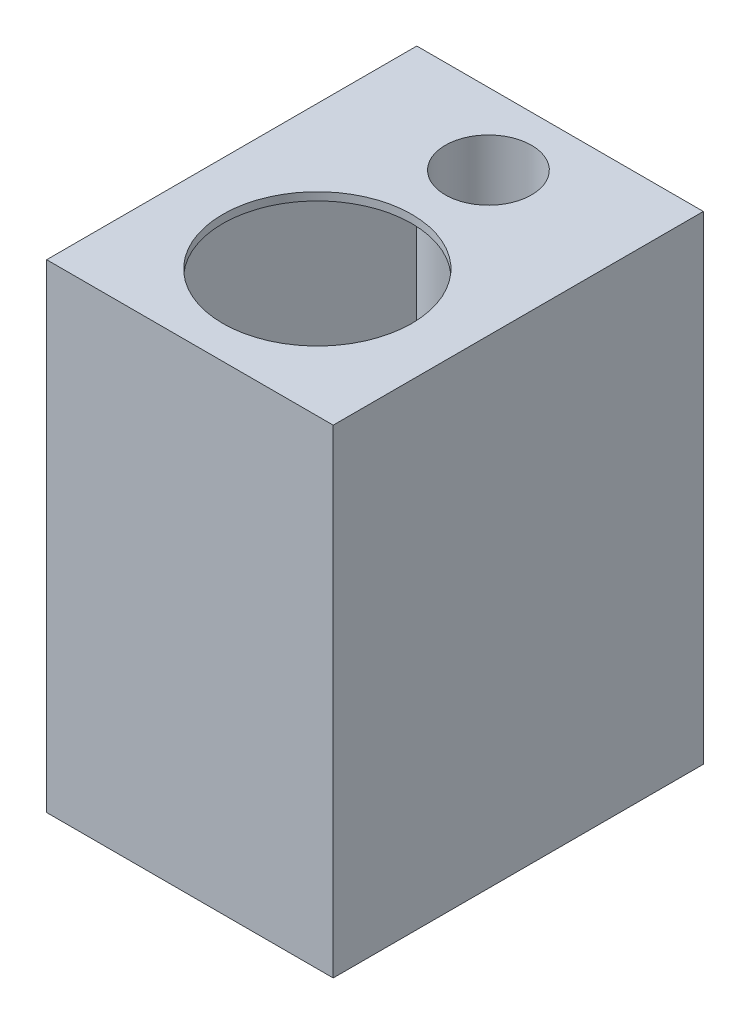
ISO-10303-21;
HEADER;
FILE_DESCRIPTION(('STEP AP214'),'2;1');
FILE_NAME('part.step','',(''),(''),'','','');
FILE_SCHEMA(('AUTOMOTIVE_DESIGN { 1 0 10303 214 1 1 1 1 }'));
ENDSEC;
DATA;
#1=APPLICATION_CONTEXT('core data for automotive mechanical design processes');
#2=APPLICATION_PROTOCOL_DEFINITION('international standard','automotive_design',2000,#1);
#3=PRODUCT_CONTEXT('',#1,'mechanical');
#4=PRODUCT('Part','Part','',(#3));
#5=PRODUCT_RELATED_PRODUCT_CATEGORY('part','',(#4));
#6=PRODUCT_DEFINITION_FORMATION('','',#4);
#7=PRODUCT_DEFINITION_CONTEXT('part definition',#1,'design');
#8=PRODUCT_DEFINITION('design','',#6,#7);
#9=PRODUCT_DEFINITION_SHAPE('','',#8);
#10=(LENGTH_UNIT() NAMED_UNIT(*) SI_UNIT(.MILLI.,.METRE.));
#11=(NAMED_UNIT(*) PLANE_ANGLE_UNIT() SI_UNIT($,.RADIAN.));
#12=(NAMED_UNIT(*) SI_UNIT($,.STERADIAN.) SOLID_ANGLE_UNIT());
#13=UNCERTAINTY_MEASURE_WITH_UNIT(LENGTH_MEASURE(1.E-05),#10,'distance_accuracy_value','');
#14=(GEOMETRIC_REPRESENTATION_CONTEXT(3) GLOBAL_UNCERTAINTY_ASSIGNED_CONTEXT((#13)) GLOBAL_UNIT_ASSIGNED_CONTEXT((#10,
#11,#12)) REPRESENTATION_CONTEXT('',''));
#15=CARTESIAN_POINT('',(0.,0.,0.));
#16=DIRECTION('',(0.,0.,1.));
#17=DIRECTION('',(1.,0.,0.));
#18=AXIS2_PLACEMENT_3D('',#15,#16,#17);
#19=CARTESIAN_POINT('',(0.,0.,0.));
#20=DIRECTION('',(0.,-1.,0.));
#21=DIRECTION('',(0.,0.,-1.));
#22=AXIS2_PLACEMENT_3D('',#19,#20,#21);
#23=PLANE('',#22);
#24=DIRECTION('',(-1.,0.,0.));
#25=VECTOR('',#24,1.);
#26=CARTESIAN_POINT('',(4.,0.,-4.));
#27=LINE('',#26,#25);
#28=CARTESIAN_POINT('',(140.,0.,-4.));
#29=VERTEX_POINT('',#28);
#30=CARTESIAN_POINT('',(4.,0.,-4.));
#31=VERTEX_POINT('',#30);
#32=EDGE_CURVE('E50',#29,#31,#27,.T.);
#33=ORIENTED_EDGE('',*,*,#32,.T.);
#34=DIRECTION('',(0.,0.,-1.));
#35=VECTOR('',#34,1.);
#36=CARTESIAN_POINT('',(4.,0.,-4.));
#37=LINE('',#36,#35);
#38=CARTESIAN_POINT('',(4.,0.,-182.));
#39=VERTEX_POINT('',#38);
#40=EDGE_CURVE('E54',#31,#39,#37,.T.);
#41=ORIENTED_EDGE('',*,*,#40,.T.);
#42=DIRECTION('',(1.,0.,0.));
#43=VECTOR('',#42,1.);
#44=CARTESIAN_POINT('',(4.,0.,-182.));
#45=LINE('',#44,#43);
#46=CARTESIAN_POINT('',(140.,0.,-182.));
#47=VERTEX_POINT('',#46);
#48=EDGE_CURVE('E129',#39,#47,#45,.T.);
#49=ORIENTED_EDGE('',*,*,#48,.T.);
#50=DIRECTION('',(0.,0.,1.));
#51=VECTOR('',#50,1.);
#52=CARTESIAN_POINT('',(140.,0.,-4.));
#53=LINE('',#52,#51);
#54=EDGE_CURVE('E108',#47,#29,#53,.T.);
#55=ORIENTED_EDGE('',*,*,#54,.T.);
#56=EDGE_LOOP('',(#33,#41,#49,#55));
#57=FACE_BOUND('',#56,.T.);
#58=CARTESIAN_POINT('',(72.,0.,-64.));
#59=DIRECTION('',(0.,1.,0.));
#60=DIRECTION('',(0.,0.,1.));
#61=AXIS2_PLACEMENT_3D('',#58,#59,#60);
#62=CIRCLE('',#61,47.5);
#63=CARTESIAN_POINT('',(72.,0.,-16.5));
#64=VERTEX_POINT('',#63);
#65=EDGE_CURVE('E127',#64,#64,#62,.T.);
#66=ORIENTED_EDGE('',*,*,#65,.T.);
#67=EDGE_LOOP('',(#66));
#68=FACE_BOUND('',#67,.T.);
#69=CARTESIAN_POINT('',(72.,0.,-150.));
#70=DIRECTION('',(0.,-1.,0.));
#71=DIRECTION('',(0.,0.,-1.));
#72=AXIS2_PLACEMENT_3D('',#69,#70,#71);
#73=CIRCLE('',#72,25.65);
#74=CARTESIAN_POINT('',(72.,0.,-124.35));
#75=VERTEX_POINT('',#74);
#76=EDGE_CURVE('E316',#75,#75,#73,.T.);
#77=ORIENTED_EDGE('',*,*,#76,.F.);
#78=EDGE_LOOP('',(#77));
#79=FACE_BOUND('',#78,.T.);
#80=ADVANCED_FACE('F35',(#57,#68,#79),#23,.T.);
#81=CARTESIAN_POINT('',(0.,4.,0.));
#82=DIRECTION('',(1.,0.,0.));
#83=DIRECTION('',(0.,0.,-1.));
#84=AXIS2_PLACEMENT_3D('',#81,#82,#83);
#85=PLANE('',#84);
#86=DIRECTION('',(0.,-1.,0.));
#87=VECTOR('',#86,1.);
#88=CARTESIAN_POINT('',(0.,4.,-186.));
#89=LINE('',#88,#87);
#90=CARTESIAN_POINT('',(0.,4.,-186.));
#91=VERTEX_POINT('',#90);
#92=CARTESIAN_POINT('',(0.,-236.6,-186.));
#93=VERTEX_POINT('',#92);
#94=EDGE_CURVE('E157',#91,#93,#89,.T.);
#95=ORIENTED_EDGE('',*,*,#94,.T.);
#96=DIRECTION('',(0.,0.,-1.));
#97=VECTOR('',#96,1.);
#98=CARTESIAN_POINT('',(0.,-236.6,0.));
#99=LINE('',#98,#97);
#100=CARTESIAN_POINT('',(0.,-236.6,0.));
#101=VERTEX_POINT('',#100);
#102=EDGE_CURVE('E113',#101,#93,#99,.T.);
#103=ORIENTED_EDGE('',*,*,#102,.F.);
#104=DIRECTION('',(0.,-1.,0.));
#105=VECTOR('',#104,1.);
#106=CARTESIAN_POINT('',(0.,4.,0.));
#107=LINE('',#106,#105);
#108=CARTESIAN_POINT('',(0.,4.,0.));
#109=VERTEX_POINT('',#108);
#110=EDGE_CURVE('E11',#109,#101,#107,.T.);
#111=ORIENTED_EDGE('',*,*,#110,.F.);
#112=DIRECTION('',(0.,0.,1.));
#113=VECTOR('',#112,1.);
#114=CARTESIAN_POINT('',(0.,4.,0.));
#115=LINE('',#114,#113);
#116=EDGE_CURVE('E148',#91,#109,#115,.T.);
#117=ORIENTED_EDGE('',*,*,#116,.F.);
#118=EDGE_LOOP('',(#95,#103,#111,#117));
#119=FACE_BOUND('',#118,.T.);
#120=ADVANCED_FACE('F37',(#119),#85,.F.);
#121=CARTESIAN_POINT('',(0.,4.,0.));
#122=DIRECTION('',(0.,0.,-1.));
#123=DIRECTION('',(-1.,0.,0.));
#124=AXIS2_PLACEMENT_3D('',#121,#122,#123);
#125=PLANE('',#124);
#126=ORIENTED_EDGE('',*,*,#110,.T.);
#127=DIRECTION('',(-1.,0.,0.));
#128=VECTOR('',#127,1.);
#129=CARTESIAN_POINT('',(0.,-236.6,0.));
#130=LINE('',#129,#128);
#131=CARTESIAN_POINT('',(144.,-236.6,0.));
#132=VERTEX_POINT('',#131);
#133=EDGE_CURVE('E145',#132,#101,#130,.T.);
#134=ORIENTED_EDGE('',*,*,#133,.F.);
#135=DIRECTION('',(0.,-1.,0.));
#136=VECTOR('',#135,1.);
#137=CARTESIAN_POINT('',(144.,4.,0.));
#138=LINE('',#137,#136);
#139=CARTESIAN_POINT('',(144.,4.,0.));
#140=VERTEX_POINT('',#139);
#141=EDGE_CURVE('E43',#140,#132,#138,.T.);
#142=ORIENTED_EDGE('',*,*,#141,.F.);
#143=DIRECTION('',(1.,0.,0.));
#144=VECTOR('',#143,1.);
#145=CARTESIAN_POINT('',(0.,4.,0.));
#146=LINE('',#145,#144);
#147=EDGE_CURVE('E151',#109,#140,#146,.T.);
#148=ORIENTED_EDGE('',*,*,#147,.F.);
#149=EDGE_LOOP('',(#126,#134,#142,#148));
#150=FACE_BOUND('',#149,.T.);
#151=ADVANCED_FACE('F171',(#150),#125,.F.);
#152=CARTESIAN_POINT('',(144.,4.,0.));
#153=DIRECTION('',(-1.,0.,0.));
#154=DIRECTION('',(0.,0.,1.));
#155=AXIS2_PLACEMENT_3D('',#152,#153,#154);
#156=PLANE('',#155);
#157=ORIENTED_EDGE('',*,*,#141,.T.);
#158=DIRECTION('',(0.,0.,1.));
#159=VECTOR('',#158,1.);
#160=CARTESIAN_POINT('',(144.,-236.6,0.));
#161=LINE('',#160,#159);
#162=CARTESIAN_POINT('',(144.,-236.6,-186.));
#163=VERTEX_POINT('',#162);
#164=EDGE_CURVE('E142',#163,#132,#161,.T.);
#165=ORIENTED_EDGE('',*,*,#164,.F.);
#166=DIRECTION('',(0.,-1.,0.));
#167=VECTOR('',#166,1.);
#168=CARTESIAN_POINT('',(144.,4.,-186.));
#169=LINE('',#168,#167);
#170=CARTESIAN_POINT('',(144.,4.,-186.));
#171=VERTEX_POINT('',#170);
#172=EDGE_CURVE('E159',#171,#163,#169,.T.);
#173=ORIENTED_EDGE('',*,*,#172,.F.);
#174=DIRECTION('',(0.,0.,-1.));
#175=VECTOR('',#174,1.);
#176=CARTESIAN_POINT('',(144.,4.,0.));
#177=LINE('',#176,#175);
#178=EDGE_CURVE('E153',#140,#171,#177,.T.);
#179=ORIENTED_EDGE('',*,*,#178,.F.);
#180=EDGE_LOOP('',(#157,#165,#173,#179));
#181=FACE_BOUND('',#180,.T.);
#182=ADVANCED_FACE('F164',(#181),#156,.F.);
#183=CARTESIAN_POINT('',(0.,4.,-186.));
#184=DIRECTION('',(0.,0.,1.));
#185=DIRECTION('',(1.,0.,0.));
#186=AXIS2_PLACEMENT_3D('',#183,#184,#185);
#187=PLANE('',#186);
#188=ORIENTED_EDGE('',*,*,#172,.T.);
#189=DIRECTION('',(1.,0.,0.));
#190=VECTOR('',#189,1.);
#191=CARTESIAN_POINT('',(0.,-236.6,-186.));
#192=LINE('',#191,#190);
#193=EDGE_CURVE('E139',#93,#163,#192,.T.);
#194=ORIENTED_EDGE('',*,*,#193,.F.);
#195=ORIENTED_EDGE('',*,*,#94,.F.);
#196=DIRECTION('',(-1.,0.,0.));
#197=VECTOR('',#196,1.);
#198=CARTESIAN_POINT('',(0.,4.,-186.));
#199=LINE('',#198,#197);
#200=EDGE_CURVE('E155',#171,#91,#199,.T.);
#201=ORIENTED_EDGE('',*,*,#200,.F.);
#202=EDGE_LOOP('',(#188,#194,#195,#201));
#203=FACE_BOUND('',#202,.T.);
#204=ADVANCED_FACE('F178',(#203),#187,.F.);
#205=CARTESIAN_POINT('',(0.,4.,0.));
#206=DIRECTION('',(0.,-1.,0.));
#207=DIRECTION('',(0.,0.,-1.));
#208=AXIS2_PLACEMENT_3D('',#205,#206,#207);
#209=PLANE('',#208);
#210=CARTESIAN_POINT('',(72.,4.,-150.));
#211=DIRECTION('',(0.,-1.,0.));
#212=DIRECTION('',(0.,0.,-1.));
#213=AXIS2_PLACEMENT_3D('',#210,#211,#212);
#214=CIRCLE('',#213,21.65);
#215=CARTESIAN_POINT('',(72.,4.,-171.65));
#216=VERTEX_POINT('',#215);
#217=EDGE_CURVE('E320',#216,#216,#214,.T.);
#218=ORIENTED_EDGE('',*,*,#217,.T.);
#219=EDGE_LOOP('',(#218));
#220=FACE_BOUND('',#219,.T.);
#221=CARTESIAN_POINT('',(72.,4.,-64.));
#222=DIRECTION('',(0.,1.,0.));
#223=DIRECTION('',(0.,0.,1.));
#224=AXIS2_PLACEMENT_3D('',#221,#222,#223);
#225=CIRCLE('',#224,47.5);
#226=CARTESIAN_POINT('',(72.,4.,-16.5));
#227=VERTEX_POINT('',#226);
#228=EDGE_CURVE('E326',#227,#227,#225,.T.);
#229=ORIENTED_EDGE('',*,*,#228,.F.);
#230=EDGE_LOOP('',(#229));
#231=FACE_BOUND('',#230,.T.);
#232=ORIENTED_EDGE('',*,*,#116,.T.);
#233=ORIENTED_EDGE('',*,*,#147,.T.);
#234=ORIENTED_EDGE('',*,*,#178,.T.);
#235=ORIENTED_EDGE('',*,*,#200,.T.);
#236=EDGE_LOOP('',(#232,#233,#234,#235));
#237=FACE_BOUND('',#236,.T.);
#238=ADVANCED_FACE('F180',(#220,#231,#237),#209,.F.);
#239=CARTESIAN_POINT('',(0.,-236.6,0.));
#240=DIRECTION('',(0.,-1.,0.));
#241=DIRECTION('',(0.,0.,-1.));
#242=AXIS2_PLACEMENT_3D('',#239,#240,#241);
#243=PLANE('',#242);
#244=ORIENTED_EDGE('',*,*,#102,.T.);
#245=ORIENTED_EDGE('',*,*,#193,.T.);
#246=ORIENTED_EDGE('',*,*,#164,.T.);
#247=ORIENTED_EDGE('',*,*,#133,.T.);
#248=EDGE_LOOP('',(#244,#245,#246,#247));
#249=FACE_BOUND('',#248,.T.);
#250=DIRECTION('',(0.,0.,-1.));
#251=VECTOR('',#250,1.);
#252=CARTESIAN_POINT('',(4.,-236.6,-4.));
#253=LINE('',#252,#251);
#254=CARTESIAN_POINT('',(4.,-236.6,-4.));
#255=VERTEX_POINT('',#254);
#256=CARTESIAN_POINT('',(4.,-236.6,-182.));
#257=VERTEX_POINT('',#256);
#258=EDGE_CURVE('E107',#255,#257,#253,.T.);
#259=ORIENTED_EDGE('',*,*,#258,.F.);
#260=DIRECTION('',(-1.,0.,0.));
#261=VECTOR('',#260,1.);
#262=CARTESIAN_POINT('',(4.,-236.6,-4.));
#263=LINE('',#262,#261);
#264=CARTESIAN_POINT('',(140.,-236.6,-4.));
#265=VERTEX_POINT('',#264);
#266=EDGE_CURVE('E98',#265,#255,#263,.T.);
#267=ORIENTED_EDGE('',*,*,#266,.F.);
#268=DIRECTION('',(0.,0.,1.));
#269=VECTOR('',#268,1.);
#270=CARTESIAN_POINT('',(140.,-236.6,-4.));
#271=LINE('',#270,#269);
#272=CARTESIAN_POINT('',(140.,-236.6,-182.));
#273=VERTEX_POINT('',#272);
#274=EDGE_CURVE('E121',#273,#265,#271,.T.);
#275=ORIENTED_EDGE('',*,*,#274,.F.);
#276=DIRECTION('',(1.,0.,0.));
#277=VECTOR('',#276,1.);
#278=CARTESIAN_POINT('',(4.,-236.6,-182.));
#279=LINE('',#278,#277);
#280=EDGE_CURVE('E119',#257,#273,#279,.T.);
#281=ORIENTED_EDGE('',*,*,#280,.F.);
#282=EDGE_LOOP('',(#259,#267,#275,#281));
#283=FACE_BOUND('',#282,.T.);
#284=ADVANCED_FACE('F117',(#249,#283),#243,.T.);
#285=CARTESIAN_POINT('',(4.,-236.6,-4.));
#286=DIRECTION('',(0.,0.,-1.));
#287=DIRECTION('',(-1.,0.,0.));
#288=AXIS2_PLACEMENT_3D('',#285,#286,#287);
#289=PLANE('',#288);
#290=ORIENTED_EDGE('',*,*,#32,.F.);
#291=DIRECTION('',(0.,1.,0.));
#292=VECTOR('',#291,1.);
#293=CARTESIAN_POINT('',(140.,-236.6,-4.));
#294=LINE('',#293,#292);
#295=EDGE_CURVE('E103',#265,#29,#294,.T.);
#296=ORIENTED_EDGE('',*,*,#295,.F.);
#297=ORIENTED_EDGE('',*,*,#266,.T.);
#298=DIRECTION('',(0.,1.,0.));
#299=VECTOR('',#298,1.);
#300=CARTESIAN_POINT('',(4.,-236.6,-4.));
#301=LINE('',#300,#299);
#302=EDGE_CURVE('E101',#255,#31,#301,.T.);
#303=ORIENTED_EDGE('',*,*,#302,.T.);
#304=EDGE_LOOP('',(#290,#296,#297,#303));
#305=FACE_BOUND('',#304,.T.);
#306=ADVANCED_FACE('F100',(#305),#289,.T.);
#307=CARTESIAN_POINT('',(4.,-236.6,-4.));
#308=DIRECTION('',(1.,0.,0.));
#309=DIRECTION('',(0.,0.,-1.));
#310=AXIS2_PLACEMENT_3D('',#307,#308,#309);
#311=PLANE('',#310);
#312=ORIENTED_EDGE('',*,*,#40,.F.);
#313=ORIENTED_EDGE('',*,*,#302,.F.);
#314=ORIENTED_EDGE('',*,*,#258,.T.);
#315=DIRECTION('',(0.,1.,0.));
#316=VECTOR('',#315,1.);
#317=CARTESIAN_POINT('',(4.,-236.6,-182.));
#318=LINE('',#317,#316);
#319=EDGE_CURVE('E114',#257,#39,#318,.T.);
#320=ORIENTED_EDGE('',*,*,#319,.T.);
#321=EDGE_LOOP('',(#312,#313,#314,#320));
#322=FACE_BOUND('',#321,.T.);
#323=ADVANCED_FACE('F111',(#322),#311,.T.);
#324=CARTESIAN_POINT('',(4.,-236.6,-182.));
#325=DIRECTION('',(0.,0.,1.));
#326=DIRECTION('',(1.,0.,0.));
#327=AXIS2_PLACEMENT_3D('',#324,#325,#326);
#328=PLANE('',#327);
#329=ORIENTED_EDGE('',*,*,#48,.F.);
#330=ORIENTED_EDGE('',*,*,#319,.F.);
#331=ORIENTED_EDGE('',*,*,#280,.T.);
#332=DIRECTION('',(0.,1.,0.));
#333=VECTOR('',#332,1.);
#334=CARTESIAN_POINT('',(140.,-236.6,-182.));
#335=LINE('',#334,#333);
#336=EDGE_CURVE('E133',#273,#47,#335,.T.);
#337=ORIENTED_EDGE('',*,*,#336,.T.);
#338=EDGE_LOOP('',(#329,#330,#331,#337));
#339=FACE_BOUND('',#338,.T.);
#340=ADVANCED_FACE('F237',(#339),#328,.T.);
#341=CARTESIAN_POINT('',(140.,-236.6,-4.));
#342=DIRECTION('',(-1.,0.,0.));
#343=DIRECTION('',(0.,0.,1.));
#344=AXIS2_PLACEMENT_3D('',#341,#342,#343);
#345=PLANE('',#344);
#346=ORIENTED_EDGE('',*,*,#54,.F.);
#347=ORIENTED_EDGE('',*,*,#336,.F.);
#348=ORIENTED_EDGE('',*,*,#274,.T.);
#349=ORIENTED_EDGE('',*,*,#295,.T.);
#350=EDGE_LOOP('',(#346,#347,#348,#349));
#351=FACE_BOUND('',#350,.T.);
#352=ADVANCED_FACE('F246',(#351),#345,.T.);
#353=CARTESIAN_POINT('',(72.,0.,-64.));
#354=DIRECTION('',(0.,1.,0.));
#355=DIRECTION('',(0.,0.,1.));
#356=AXIS2_PLACEMENT_3D('',#353,#354,#355);
#357=CYLINDRICAL_SURFACE('',#356,47.5);
#358=ORIENTED_EDGE('',*,*,#65,.F.);
#359=EDGE_LOOP('',(#358));
#360=FACE_BOUND('',#359,.T.);
#361=ORIENTED_EDGE('',*,*,#228,.T.);
#362=EDGE_LOOP('',(#361));
#363=FACE_BOUND('',#362,.T.);
#364=ADVANCED_FACE('F256',(#360,#363),#357,.F.);
#365=CARTESIAN_POINT('',(72.,4.,-150.));
#366=DIRECTION('',(0.,-1.,0.));
#367=DIRECTION('',(0.,0.,-1.));
#368=AXIS2_PLACEMENT_3D('',#365,#366,#367);
#369=CYLINDRICAL_SURFACE('',#368,21.65);
#370=ORIENTED_EDGE('',*,*,#217,.F.);
#371=EDGE_LOOP('',(#370));
#372=FACE_BOUND('',#371,.T.);
#373=CARTESIAN_POINT('',(72.,-103.7,-150.));
#374=DIRECTION('',(0.,-1.,0.));
#375=DIRECTION('',(0.,0.,-1.));
#376=AXIS2_PLACEMENT_3D('',#373,#374,#375);
#377=CIRCLE('',#376,21.65);
#378=CARTESIAN_POINT('',(72.,-103.7,-171.65));
#379=VERTEX_POINT('',#378);
#380=EDGE_CURVE('E318',#379,#379,#377,.T.);
#381=ORIENTED_EDGE('',*,*,#380,.T.);
#382=EDGE_LOOP('',(#381));
#383=FACE_BOUND('',#382,.T.);
#384=ADVANCED_FACE('F265',(#372,#383),#369,.F.);
#385=CARTESIAN_POINT('',(72.,-103.7,-150.));
#386=DIRECTION('',(0.,-1.,0.));
#387=DIRECTION('',(0.,0.,-1.));
#388=AXIS2_PLACEMENT_3D('',#385,#386,#387);
#389=PLANE('',#388);
#390=CARTESIAN_POINT('',(72.,-103.7,-150.));
#391=DIRECTION('',(0.,-1.,0.));
#392=DIRECTION('',(0.,0.,-1.));
#393=AXIS2_PLACEMENT_3D('',#390,#391,#392);
#394=CIRCLE('',#393,25.65);
#395=CARTESIAN_POINT('',(72.,-103.7,-124.35));
#396=VERTEX_POINT('',#395);
#397=EDGE_CURVE('E313',#396,#396,#394,.T.);
#398=ORIENTED_EDGE('',*,*,#397,.T.);
#399=EDGE_LOOP('',(#398));
#400=FACE_BOUND('',#399,.T.);
#401=ORIENTED_EDGE('',*,*,#380,.F.);
#402=EDGE_LOOP('',(#401));
#403=FACE_BOUND('',#402,.T.);
#404=ADVANCED_FACE('F286',(#400,#403),#389,.T.);
#405=CARTESIAN_POINT('',(72.,-103.7,-150.));
#406=DIRECTION('',(0.,1.,0.));
#407=DIRECTION('',(0.,0.,1.));
#408=AXIS2_PLACEMENT_3D('',#405,#406,#407);
#409=CYLINDRICAL_SURFACE('',#408,25.65);
#410=CARTESIAN_POINT('',(72.,-103.7,-124.35));
#411=CARTESIAN_POINT('',(72.,-102.619791666667,-124.35));
#412=CARTESIAN_POINT('',(72.,-101.539583333333,-124.35));
#413=CARTESIAN_POINT('',(72.,-99.3791666666667,-124.35));
#414=CARTESIAN_POINT('',(72.,-98.2989583333333,-124.35));
#415=CARTESIAN_POINT('',(72.,-96.1385416666667,-124.35));
#416=CARTESIAN_POINT('',(72.,-95.0583333333333,-124.35));
#417=CARTESIAN_POINT('',(72.,-92.8979166666667,-124.35));
#418=CARTESIAN_POINT('',(72.,-91.8177083333333,-124.35));
#419=CARTESIAN_POINT('',(72.,-89.6572916666667,-124.35));
#420=CARTESIAN_POINT('',(72.,-88.5770833333333,-124.35));
#421=CARTESIAN_POINT('',(72.,-86.4166666666667,-124.35));
#422=CARTESIAN_POINT('',(72.,-85.3364583333333,-124.35));
#423=CARTESIAN_POINT('',(72.,-83.1760416666667,-124.35));
#424=CARTESIAN_POINT('',(72.,-82.0958333333333,-124.35));
#425=CARTESIAN_POINT('',(72.,-79.9354166666667,-124.35));
#426=CARTESIAN_POINT('',(72.,-78.8552083333333,-124.35));
#427=CARTESIAN_POINT('',(72.,-76.6947916666667,-124.35));
#428=CARTESIAN_POINT('',(72.,-75.6145833333333,-124.35));
#429=CARTESIAN_POINT('',(72.,-73.4541666666667,-124.35));
#430=CARTESIAN_POINT('',(72.,-72.3739583333333,-124.35));
#431=CARTESIAN_POINT('',(72.,-70.2135416666667,-124.35));
#432=CARTESIAN_POINT('',(72.,-69.1333333333333,-124.35));
#433=CARTESIAN_POINT('',(72.,-66.9729166666667,-124.35));
#434=CARTESIAN_POINT('',(72.,-65.8927083333333,-124.35));
#435=CARTESIAN_POINT('',(72.,-63.7322916666667,-124.35));
#436=CARTESIAN_POINT('',(72.,-62.6520833333333,-124.35));
#437=CARTESIAN_POINT('',(72.,-60.4916666666667,-124.35));
#438=CARTESIAN_POINT('',(72.,-59.4114583333333,-124.35));
#439=CARTESIAN_POINT('',(72.,-57.2510416666667,-124.35));
#440=CARTESIAN_POINT('',(72.,-56.1708333333333,-124.35));
#441=CARTESIAN_POINT('',(72.,-54.0104166666667,-124.35));
#442=CARTESIAN_POINT('',(72.,-52.9302083333333,-124.35));
#443=CARTESIAN_POINT('',(72.,-50.7697916666667,-124.35));
#444=CARTESIAN_POINT('',(72.,-49.6895833333333,-124.35));
#445=CARTESIAN_POINT('',(72.,-47.5291666666667,-124.35));
#446=CARTESIAN_POINT('',(72.,-46.4489583333333,-124.35));
#447=CARTESIAN_POINT('',(72.,-44.2885416666667,-124.35));
#448=CARTESIAN_POINT('',(72.,-43.2083333333333,-124.35));
#449=CARTESIAN_POINT('',(72.,-41.0479166666667,-124.35));
#450=CARTESIAN_POINT('',(72.,-39.9677083333333,-124.35));
#451=CARTESIAN_POINT('',(72.,-37.8072916666667,-124.35));
#452=CARTESIAN_POINT('',(72.,-36.7270833333333,-124.35));
#453=CARTESIAN_POINT('',(72.,-34.5666666666667,-124.35));
#454=CARTESIAN_POINT('',(72.,-33.4864583333333,-124.35));
#455=CARTESIAN_POINT('',(72.,-31.3260416666667,-124.35));
#456=CARTESIAN_POINT('',(72.,-30.2458333333333,-124.35));
#457=CARTESIAN_POINT('',(72.,-28.0854166666667,-124.35));
#458=CARTESIAN_POINT('',(72.,-27.0052083333333,-124.35));
#459=CARTESIAN_POINT('',(72.,-24.8447916666667,-124.35));
#460=CARTESIAN_POINT('',(72.,-23.7645833333333,-124.35));
#461=CARTESIAN_POINT('',(72.,-21.6041666666667,-124.35));
#462=CARTESIAN_POINT('',(72.,-20.5239583333333,-124.35));
#463=CARTESIAN_POINT('',(72.,-18.3635416666667,-124.35));
#464=CARTESIAN_POINT('',(72.,-17.2833333333333,-124.35));
#465=CARTESIAN_POINT('',(72.,-15.1229166666667,-124.35));
#466=CARTESIAN_POINT('',(72.,-14.0427083333333,-124.35));
#467=CARTESIAN_POINT('',(72.,-11.8822916666667,-124.35));
#468=CARTESIAN_POINT('',(72.,-10.8020833333333,-124.35));
#469=CARTESIAN_POINT('',(72.,-8.64166666666667,-124.35));
#470=CARTESIAN_POINT('',(72.,-7.56145833333333,-124.35));
#471=CARTESIAN_POINT('',(72.,-5.40104166666666,-124.35));
#472=CARTESIAN_POINT('',(72.,-4.32083333333333,-124.35));
#473=CARTESIAN_POINT('',(72.,-2.16041666666667,-124.35));
#474=CARTESIAN_POINT('',(72.,-1.08020833333333,-124.35));
#475=CARTESIAN_POINT('',(72.,0.,-124.35));
#476=B_SPLINE_CURVE_WITH_KNOTS('',3,(#410,#411,#412,#413,#414,#415,#416,#417,#418,#419,#420,
#421,#422,#423,#424,#425,#426,#427,#428,#429,#430,#431,#432,#433,#434,#435,#436,#437,#438,#439,
#440,#441,#442,#443,#444,#445,#446,#447,#448,#449,#450,#451,#452,#453,#454,#455,#456,#457,#458,
#459,#460,#461,#462,#463,#464,#465,#466,#467,#468,#469,#470,#471,#472,#473,#474,#475),
.UNSPECIFIED.,.F.,.F.,(4,2,2,2,2,2,2,2,2,2,2,2,2,2,2,2,2,2,2,2,2,2,2,2,2,2,2,2,2,2,2,2,4),(0.,
3.24062500000001,6.48125000000001,9.721875,12.9625,16.203125,19.44375,22.684375,25.925,
29.165625,32.40625,35.646875,38.8875,42.128125,45.36875,48.609375,51.85,55.090625,58.33125,
61.571875,64.8125,68.053125,71.29375,74.534375,77.775,81.015625,84.25625,87.496875,90.7375,
93.978125,97.21875,100.459375,103.7),.UNSPECIFIED.);
#477=EDGE_CURVE('BSEAM296',#396,#75,#476,.T.);
#478=ORIENTED_EDGE('',*,*,#397,.F.);
#479=ORIENTED_EDGE('',*,*,#76,.T.);
#480=ORIENTED_EDGE('',*,*,#477,.T.);
#481=ORIENTED_EDGE('',*,*,#477,.F.);
#482=EDGE_LOOP('',(#478,#480,#479,#481));
#483=FACE_BOUND('',#482,.T.);
#484=ADVANCED_FACE('F296',(#483),#409,.T.);
#485=CLOSED_SHELL('',(#80,#120,#151,#182,#204,#238,#284,#306,#323,#340,#352,#364,#384,#404,#484));
#486=MANIFOLD_SOLID_BREP('B2',#485);
#487=ADVANCED_BREP_SHAPE_REPRESENTATION('',(#18,#486),#14);
#488=SHAPE_DEFINITION_REPRESENTATION(#9,#487);
ENDSEC;
END-ISO-10303-21;
